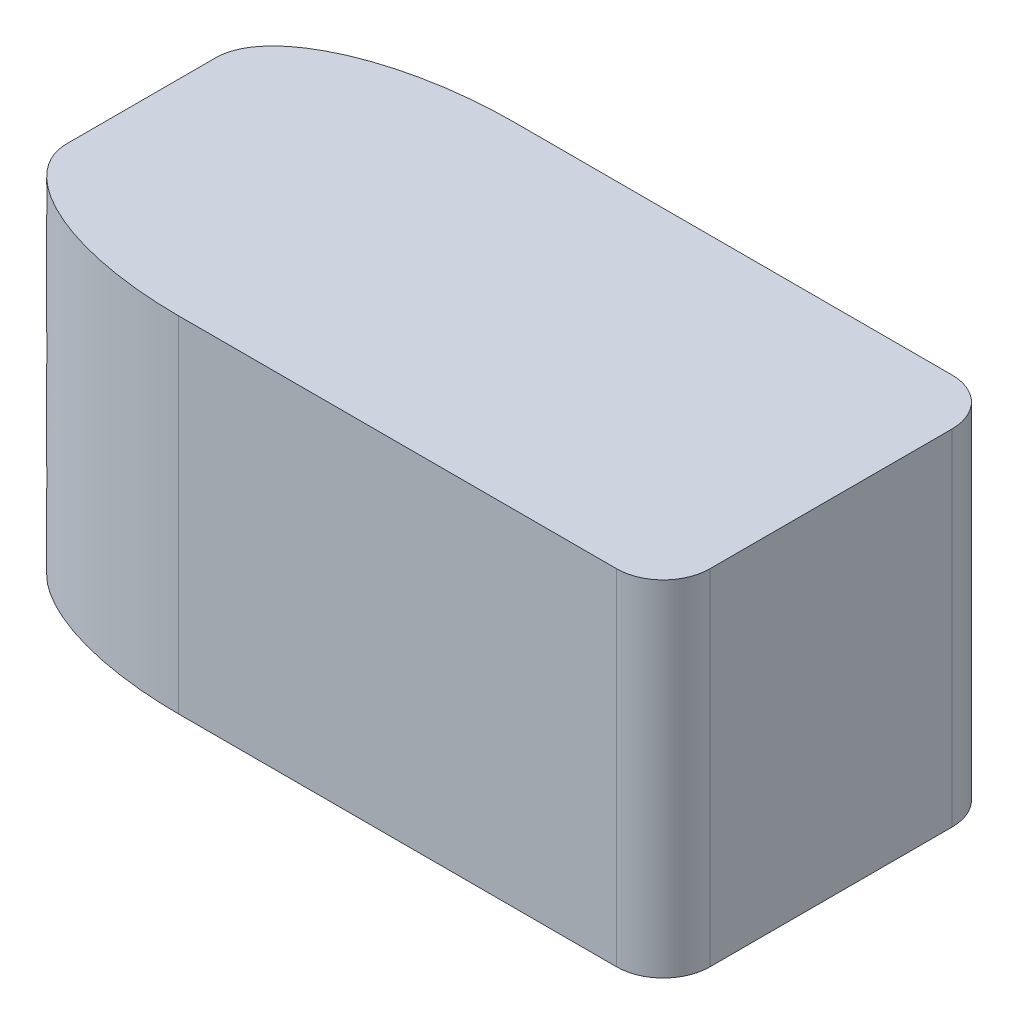
ISO-10303-21;
HEADER;
FILE_DESCRIPTION(('STEP AP214'),'2;1');
FILE_NAME('part.step','',(''),(''),'','','');
FILE_SCHEMA(('AUTOMOTIVE_DESIGN { 1 0 10303 214 1 1 1 1 }'));
ENDSEC;
DATA;
#1=APPLICATION_CONTEXT('core data for automotive mechanical design processes');
#2=APPLICATION_PROTOCOL_DEFINITION('international standard','automotive_design',2000,#1);
#3=PRODUCT_CONTEXT('',#1,'mechanical');
#4=PRODUCT('Part','Part','',(#3));
#5=PRODUCT_RELATED_PRODUCT_CATEGORY('part','',(#4));
#6=PRODUCT_DEFINITION_FORMATION('','',#4);
#7=PRODUCT_DEFINITION_CONTEXT('part definition',#1,'design');
#8=PRODUCT_DEFINITION('design','',#6,#7);
#9=PRODUCT_DEFINITION_SHAPE('','',#8);
#10=(LENGTH_UNIT() NAMED_UNIT(*) SI_UNIT(.MILLI.,.METRE.));
#11=(NAMED_UNIT(*) PLANE_ANGLE_UNIT() SI_UNIT($,.RADIAN.));
#12=(NAMED_UNIT(*) SI_UNIT($,.STERADIAN.) SOLID_ANGLE_UNIT());
#13=UNCERTAINTY_MEASURE_WITH_UNIT(LENGTH_MEASURE(1.E-05),#10,'distance_accuracy_value','');
#14=(GEOMETRIC_REPRESENTATION_CONTEXT(3) GLOBAL_UNCERTAINTY_ASSIGNED_CONTEXT((#13)) GLOBAL_UNIT_ASSIGNED_CONTEXT((#10,
#11,#12)) REPRESENTATION_CONTEXT('',''));
#15=CARTESIAN_POINT('',(0.,0.,0.));
#16=DIRECTION('',(0.,0.,1.));
#17=DIRECTION('',(1.,0.,0.));
#18=AXIS2_PLACEMENT_3D('',#15,#16,#17);
#19=CARTESIAN_POINT('',(-37.,18.5,18.));
#20=DIRECTION('',(1.,0.,0.));
#21=DIRECTION('',(0.,0.,-1.));
#22=AXIS2_PLACEMENT_3D('',#19,#20,#21);
#23=PLANE('',#22);
#24=DIRECTION('',(0.,0.,1.));
#25=VECTOR('',#24,1.);
#26=CARTESIAN_POINT('',(-37.,18.5,18.));
#27=LINE('',#26,#25);
#28=CARTESIAN_POINT('',(-37.,18.5,-8.));
#29=VERTEX_POINT('',#28);
#30=CARTESIAN_POINT('',(-37.,18.5,8.));
#31=VERTEX_POINT('',#30);
#32=EDGE_CURVE('E143',#29,#31,#27,.T.);
#33=ORIENTED_EDGE('',*,*,#32,.F.);
#34=CARTESIAN_POINT('',(-37.,-20.35,-8.));
#35=CARTESIAN_POINT('',(-37.,-6.78333333333331,-8.));
#36=CARTESIAN_POINT('',(-37.,6.78333333333332,-8.));
#37=CARTESIAN_POINT('',(-37.,20.35,-8.));
#38=(BOUNDED_CURVE() B_SPLINE_CURVE(3,(#34,#35,#36,#37),.UNSPECIFIED.,.F.,
.F.) B_SPLINE_CURVE_WITH_KNOTS((4,4),(-0.00185,0.03885),
.UNSPECIFIED.) CURVE() GEOMETRIC_REPRESENTATION_ITEM() RATIONAL_B_SPLINE_CURVE((1.,1.,1.,1.)) REPRESENTATION_ITEM(''));
#39=CARTESIAN_POINT('',(-37.,-18.5,-8.));
#40=VERTEX_POINT('',#39);
#41=EDGE_CURVE('E124',#29,#40,#38,.F.);
#42=ORIENTED_EDGE('',*,*,#41,.T.);
#43=DIRECTION('',(0.,0.,1.));
#44=VECTOR('',#43,1.);
#45=CARTESIAN_POINT('',(-37.,-18.5,18.));
#46=LINE('',#45,#44);
#47=CARTESIAN_POINT('',(-37.,-18.5,8.));
#48=VERTEX_POINT('',#47);
#49=EDGE_CURVE('E140',#40,#48,#46,.T.);
#50=ORIENTED_EDGE('',*,*,#49,.T.);
#51=CARTESIAN_POINT('',(-37.,20.35,8.));
#52=CARTESIAN_POINT('',(-37.,6.78333333333332,8.));
#53=CARTESIAN_POINT('',(-37.,-6.78333333333331,8.));
#54=CARTESIAN_POINT('',(-37.,-20.35,8.));
#55=(BOUNDED_CURVE() B_SPLINE_CURVE(3,(#51,#52,#53,#54),.UNSPECIFIED.,.F.,
.F.) B_SPLINE_CURVE_WITH_KNOTS((4,4),(-0.00185,0.03885),
.UNSPECIFIED.) CURVE() GEOMETRIC_REPRESENTATION_ITEM() RATIONAL_B_SPLINE_CURVE((1.,1.,1.,1.)) REPRESENTATION_ITEM(''));
#56=EDGE_CURVE('E144',#48,#31,#55,.F.);
#57=ORIENTED_EDGE('',*,*,#56,.T.);
#58=EDGE_LOOP('',(#33,#42,#50,#57));
#59=FACE_BOUND('',#58,.T.);
#60=ADVANCED_FACE('F51',(#59),#23,.F.);
#61=CARTESIAN_POINT('',(37.,18.5,18.));
#62=DIRECTION('',(0.,0.,-1.));
#63=DIRECTION('',(-1.,0.,0.));
#64=AXIS2_PLACEMENT_3D('',#61,#62,#63);
#65=PLANE('',#64);
#66=DIRECTION('',(1.,0.,0.));
#67=VECTOR('',#66,1.);
#68=CARTESIAN_POINT('',(37.,-18.5,18.));
#69=LINE('',#68,#67);
#70=CARTESIAN_POINT('',(-15.,-18.5,18.));
#71=VERTEX_POINT('',#70);
#72=CARTESIAN_POINT('',(32.,-18.5,18.));
#73=VERTEX_POINT('',#72);
#74=EDGE_CURVE('E150',#71,#73,#69,.T.);
#75=ORIENTED_EDGE('',*,*,#74,.T.);
#76=DIRECTION('',(0.,-1.,0.));
#77=VECTOR('',#76,1.);
#78=CARTESIAN_POINT('',(32.,18.5,18.));
#79=LINE('',#78,#77);
#80=CARTESIAN_POINT('',(32.,18.5,18.));
#81=VERTEX_POINT('',#80);
#82=EDGE_CURVE('E12',#73,#81,#79,.F.);
#83=ORIENTED_EDGE('',*,*,#82,.T.);
#84=DIRECTION('',(1.,0.,0.));
#85=VECTOR('',#84,1.);
#86=CARTESIAN_POINT('',(37.,18.5,18.));
#87=LINE('',#86,#85);
#88=CARTESIAN_POINT('',(-15.,18.5,18.));
#89=VERTEX_POINT('',#88);
#90=EDGE_CURVE('E204',#89,#81,#87,.T.);
#91=ORIENTED_EDGE('',*,*,#90,.F.);
#92=CARTESIAN_POINT('',(-15.,-20.35,18.));
#93=CARTESIAN_POINT('',(-15.,-6.78333333333331,18.));
#94=CARTESIAN_POINT('',(-15.,6.78333333333332,18.));
#95=CARTESIAN_POINT('',(-15.,20.35,18.));
#96=(BOUNDED_CURVE() B_SPLINE_CURVE(3,(#92,#93,#94,#95),.UNSPECIFIED.,.F.,
.F.) B_SPLINE_CURVE_WITH_KNOTS((4,4),(-0.00185,0.03885),
.UNSPECIFIED.) CURVE() GEOMETRIC_REPRESENTATION_ITEM() RATIONAL_B_SPLINE_CURVE((1.,1.,1.,1.)) REPRESENTATION_ITEM(''));
#97=EDGE_CURVE('E228',#89,#71,#96,.F.);
#98=ORIENTED_EDGE('',*,*,#97,.T.);
#99=EDGE_LOOP('',(#75,#83,#91,#98));
#100=FACE_BOUND('',#99,.T.);
#101=ADVANCED_FACE('F350',(#100),#65,.F.);
#102=CARTESIAN_POINT('',(37.,18.5,18.));
#103=DIRECTION('',(-1.,0.,0.));
#104=DIRECTION('',(0.,0.,1.));
#105=AXIS2_PLACEMENT_3D('',#102,#103,#104);
#106=PLANE('',#105);
#107=DIRECTION('',(0.,0.,-1.));
#108=VECTOR('',#107,1.);
#109=CARTESIAN_POINT('',(37.,-18.5,18.));
#110=LINE('',#109,#108);
#111=CARTESIAN_POINT('',(37.,-18.5,13.));
#112=VERTEX_POINT('',#111);
#113=CARTESIAN_POINT('',(37.,-18.5,-13.));
#114=VERTEX_POINT('',#113);
#115=EDGE_CURVE('E152',#112,#114,#110,.T.);
#116=ORIENTED_EDGE('',*,*,#115,.T.);
#117=DIRECTION('',(0.,-1.,0.));
#118=VECTOR('',#117,1.);
#119=CARTESIAN_POINT('',(37.,18.5,-13.));
#120=LINE('',#119,#118);
#121=CARTESIAN_POINT('',(37.,18.5,-13.));
#122=VERTEX_POINT('',#121);
#123=EDGE_CURVE('E72',#114,#122,#120,.F.);
#124=ORIENTED_EDGE('',*,*,#123,.T.);
#125=DIRECTION('',(0.,0.,-1.));
#126=VECTOR('',#125,1.);
#127=CARTESIAN_POINT('',(37.,18.5,18.));
#128=LINE('',#127,#126);
#129=CARTESIAN_POINT('',(37.,18.5,13.));
#130=VERTEX_POINT('',#129);
#131=EDGE_CURVE('E212',#130,#122,#128,.T.);
#132=ORIENTED_EDGE('',*,*,#131,.F.);
#133=DIRECTION('',(0.,-1.,0.));
#134=VECTOR('',#133,1.);
#135=CARTESIAN_POINT('',(37.,18.5,13.));
#136=LINE('',#135,#134);
#137=EDGE_CURVE('E232',#130,#112,#136,.T.);
#138=ORIENTED_EDGE('',*,*,#137,.T.);
#139=EDGE_LOOP('',(#116,#124,#132,#138));
#140=FACE_BOUND('',#139,.T.);
#141=ADVANCED_FACE('F241',(#140),#106,.F.);
#142=CARTESIAN_POINT('',(37.,18.5,-18.));
#143=DIRECTION('',(0.,0.,1.));
#144=DIRECTION('',(1.,0.,0.));
#145=AXIS2_PLACEMENT_3D('',#142,#143,#144);
#146=PLANE('',#145);
#147=DIRECTION('',(-1.,0.,0.));
#148=VECTOR('',#147,1.);
#149=CARTESIAN_POINT('',(37.,18.5,-18.));
#150=LINE('',#149,#148);
#151=CARTESIAN_POINT('',(32.,18.5,-18.));
#152=VERTEX_POINT('',#151);
#153=CARTESIAN_POINT('',(-15.,18.5,-18.));
#154=VERTEX_POINT('',#153);
#155=EDGE_CURVE('E216',#152,#154,#150,.T.);
#156=ORIENTED_EDGE('',*,*,#155,.F.);
#157=DIRECTION('',(0.,-1.,0.));
#158=VECTOR('',#157,1.);
#159=CARTESIAN_POINT('',(32.,18.5,-18.));
#160=LINE('',#159,#158);
#161=CARTESIAN_POINT('',(32.,-18.5,-18.));
#162=VERTEX_POINT('',#161);
#163=EDGE_CURVE('E224',#152,#162,#160,.T.);
#164=ORIENTED_EDGE('',*,*,#163,.T.);
#165=DIRECTION('',(-1.,0.,0.));
#166=VECTOR('',#165,1.);
#167=CARTESIAN_POINT('',(37.,-18.5,-18.));
#168=LINE('',#167,#166);
#169=CARTESIAN_POINT('',(-15.,-18.5,-18.));
#170=VERTEX_POINT('',#169);
#171=EDGE_CURVE('E222',#162,#170,#168,.T.);
#172=ORIENTED_EDGE('',*,*,#171,.T.);
#173=CARTESIAN_POINT('',(-15.,20.35,-18.));
#174=CARTESIAN_POINT('',(-15.,6.78333333333332,-18.));
#175=CARTESIAN_POINT('',(-15.,-6.78333333333331,-18.));
#176=CARTESIAN_POINT('',(-15.,-20.35,-18.));
#177=(BOUNDED_CURVE() B_SPLINE_CURVE(3,(#173,#174,#175,#176),.UNSPECIFIED.,.F.,
.F.) B_SPLINE_CURVE_WITH_KNOTS((4,4),(-0.00185,0.03885),
.UNSPECIFIED.) CURVE() GEOMETRIC_REPRESENTATION_ITEM() RATIONAL_B_SPLINE_CURVE((1.,1.,1.,1.)) REPRESENTATION_ITEM(''));
#178=EDGE_CURVE('E127',#170,#154,#177,.F.);
#179=ORIENTED_EDGE('',*,*,#178,.T.);
#180=EDGE_LOOP('',(#156,#164,#172,#179));
#181=FACE_BOUND('',#180,.T.);
#182=ADVANCED_FACE('F186',(#181),#146,.F.);
#183=CARTESIAN_POINT('',(0.,18.5,0.));
#184=DIRECTION('',(0.,1.,0.));
#185=DIRECTION('',(0.,0.,1.));
#186=AXIS2_PLACEMENT_3D('',#183,#184,#185);
#187=PLANE('',#186);
#188=ORIENTED_EDGE('',*,*,#131,.T.);
#189=CARTESIAN_POINT('',(32.,18.5,-13.));
#190=DIRECTION('',(0.,1.,0.));
#191=DIRECTION('',(0.,0.,1.));
#192=AXIS2_PLACEMENT_3D('',#189,#190,#191);
#193=CIRCLE('',#192,5.);
#194=EDGE_CURVE('E59',#122,#152,#193,.T.);
#195=ORIENTED_EDGE('',*,*,#194,.T.);
#196=ORIENTED_EDGE('',*,*,#155,.T.);
#197=CARTESIAN_POINT('',(-37.,18.5,-8.));
#198=CARTESIAN_POINT('',(-37.,18.5,-18.));
#199=CARTESIAN_POINT('',(-15.,18.5,-18.));
#200=(BOUNDED_CURVE() B_SPLINE_CURVE(2,(#197,#198,#199),.UNSPECIFIED.,.F.,
.F.) B_SPLINE_CURVE_WITH_KNOTS((3,3),(0.,1.),
.UNSPECIFIED.) CURVE() GEOMETRIC_REPRESENTATION_ITEM() RATIONAL_B_SPLINE_CURVE((1.,
0.707106781186548,1.)) REPRESENTATION_ITEM(''));
#201=EDGE_CURVE('E245',#154,#29,#200,.F.);
#202=ORIENTED_EDGE('',*,*,#201,.T.);
#203=ORIENTED_EDGE('',*,*,#32,.T.);
#204=CARTESIAN_POINT('',(-15.,18.5,18.));
#205=CARTESIAN_POINT('',(-37.,18.5,18.));
#206=CARTESIAN_POINT('',(-37.,18.5,8.));
#207=(BOUNDED_CURVE() B_SPLINE_CURVE(2,(#204,#205,#206),.UNSPECIFIED.,.F.,
.F.) B_SPLINE_CURVE_WITH_KNOTS((3,3),(0.,1.),
.UNSPECIFIED.) CURVE() GEOMETRIC_REPRESENTATION_ITEM() RATIONAL_B_SPLINE_CURVE((1.,
0.707106781186547,1.)) REPRESENTATION_ITEM(''));
#208=EDGE_CURVE('E244',#31,#89,#207,.F.);
#209=ORIENTED_EDGE('',*,*,#208,.T.);
#210=ORIENTED_EDGE('',*,*,#90,.T.);
#211=CARTESIAN_POINT('',(32.,18.5,13.));
#212=DIRECTION('',(0.,1.,0.));
#213=DIRECTION('',(0.,0.,1.));
#214=AXIS2_PLACEMENT_3D('',#211,#212,#213);
#215=CIRCLE('',#214,5.);
#216=EDGE_CURVE('E236',#81,#130,#215,.T.);
#217=ORIENTED_EDGE('',*,*,#216,.T.);
#218=EDGE_LOOP('',(#188,#195,#196,#202,#203,#209,#210,#217));
#219=FACE_BOUND('',#218,.T.);
#220=ADVANCED_FACE('F184',(#219),#187,.T.);
#221=CARTESIAN_POINT('',(0.,-18.5,0.));
#222=DIRECTION('',(0.,1.,0.));
#223=DIRECTION('',(0.,0.,1.));
#224=AXIS2_PLACEMENT_3D('',#221,#222,#223);
#225=PLANE('',#224);
#226=ORIENTED_EDGE('',*,*,#171,.F.);
#227=CARTESIAN_POINT('',(32.,-18.5,-13.));
#228=DIRECTION('',(0.,1.,0.));
#229=DIRECTION('',(0.,0.,1.));
#230=AXIS2_PLACEMENT_3D('',#227,#228,#229);
#231=CIRCLE('',#230,5.);
#232=EDGE_CURVE('E230',#162,#114,#231,.F.);
#233=ORIENTED_EDGE('',*,*,#232,.T.);
#234=ORIENTED_EDGE('',*,*,#115,.F.);
#235=CARTESIAN_POINT('',(32.,-18.5,13.));
#236=DIRECTION('',(0.,1.,0.));
#237=DIRECTION('',(0.,0.,1.));
#238=AXIS2_PLACEMENT_3D('',#235,#236,#237);
#239=CIRCLE('',#238,5.);
#240=EDGE_CURVE('E227',#112,#73,#239,.F.);
#241=ORIENTED_EDGE('',*,*,#240,.T.);
#242=ORIENTED_EDGE('',*,*,#74,.F.);
#243=CARTESIAN_POINT('',(-37.,-18.5,8.));
#244=CARTESIAN_POINT('',(-37.,-18.5,18.));
#245=CARTESIAN_POINT('',(-15.,-18.5,18.));
#246=(BOUNDED_CURVE() B_SPLINE_CURVE(2,(#243,#244,#245),.UNSPECIFIED.,.F.,
.F.) B_SPLINE_CURVE_WITH_KNOTS((3,3),(0.,1.),
.UNSPECIFIED.) CURVE() GEOMETRIC_REPRESENTATION_ITEM() RATIONAL_B_SPLINE_CURVE((1.,
0.707106781186547,1.)) REPRESENTATION_ITEM(''));
#247=EDGE_CURVE('E133',#71,#48,#246,.F.);
#248=ORIENTED_EDGE('',*,*,#247,.T.);
#249=ORIENTED_EDGE('',*,*,#49,.F.);
#250=CARTESIAN_POINT('',(-15.,-18.5,-18.));
#251=CARTESIAN_POINT('',(-37.,-18.5,-18.));
#252=CARTESIAN_POINT('',(-37.,-18.5,-8.));
#253=(BOUNDED_CURVE() B_SPLINE_CURVE(2,(#250,#251,#252),.UNSPECIFIED.,.F.,
.F.) B_SPLINE_CURVE_WITH_KNOTS((3,3),(0.,1.),
.UNSPECIFIED.) CURVE() GEOMETRIC_REPRESENTATION_ITEM() RATIONAL_B_SPLINE_CURVE((1.,
0.707106781186548,1.)) REPRESENTATION_ITEM(''));
#254=EDGE_CURVE('E119',#40,#170,#253,.F.);
#255=ORIENTED_EDGE('',*,*,#254,.T.);
#256=EDGE_LOOP('',(#226,#233,#234,#241,#242,#248,#249,#255));
#257=FACE_BOUND('',#256,.T.);
#258=ADVANCED_FACE('F147',(#257),#225,.F.);
#259=CARTESIAN_POINT('',(-37.,20.35,-8.));
#260=CARTESIAN_POINT('',(-37.,6.78333333333332,-8.));
#261=CARTESIAN_POINT('',(-37.,-6.78333333333331,-8.));
#262=CARTESIAN_POINT('',(-37.,-20.35,-8.));
#263=CARTESIAN_POINT('',(-37.,20.35,-18.));
#264=CARTESIAN_POINT('',(-37.,6.78333333333332,-18.));
#265=CARTESIAN_POINT('',(-37.,-6.78333333333331,-18.));
#266=CARTESIAN_POINT('',(-37.,-20.35,-18.));
#267=CARTESIAN_POINT('',(-15.,20.35,-18.));
#268=CARTESIAN_POINT('',(-15.,6.78333333333332,-18.));
#269=CARTESIAN_POINT('',(-15.,-6.78333333333331,-18.));
#270=CARTESIAN_POINT('',(-15.,-20.35,-18.));
#271=(BOUNDED_SURFACE() B_SPLINE_SURFACE(2,3,((#259,#260,#261,#262),(#263,#264,#265,#266),(#267,
#268,#269,#270)),.UNSPECIFIED.,.F.,.F.,.F.) B_SPLINE_SURFACE_WITH_KNOTS((3,3),(4,4),(0.,1.),
(-0.00185,0.03885),
.UNSPECIFIED.) GEOMETRIC_REPRESENTATION_ITEM() RATIONAL_B_SPLINE_SURFACE(((1.,1.,1.,1.),
(0.707106781186548,0.707106781186548,0.707106781186548,0.707106781186548),(1.,1.,1.,1.))) REPRESENTATION_ITEM('') SURFACE());
#272=ORIENTED_EDGE('',*,*,#201,.F.);
#273=ORIENTED_EDGE('',*,*,#178,.F.);
#274=ORIENTED_EDGE('',*,*,#254,.F.);
#275=ORIENTED_EDGE('',*,*,#41,.F.);
#276=EDGE_LOOP('',(#272,#273,#274,#275));
#277=FACE_BOUND('',#276,.T.);
#278=ADVANCED_FACE('F123',(#277),#271,.T.);
#279=CARTESIAN_POINT('',(-15.,20.35,18.));
#280=CARTESIAN_POINT('',(-15.,6.78333333333332,18.));
#281=CARTESIAN_POINT('',(-15.,-6.78333333333331,18.));
#282=CARTESIAN_POINT('',(-15.,-20.35,18.));
#283=CARTESIAN_POINT('',(-37.,20.35,18.));
#284=CARTESIAN_POINT('',(-37.,6.78333333333332,18.));
#285=CARTESIAN_POINT('',(-37.,-6.78333333333331,18.));
#286=CARTESIAN_POINT('',(-37.,-20.35,18.));
#287=CARTESIAN_POINT('',(-37.,20.35,8.));
#288=CARTESIAN_POINT('',(-37.,6.78333333333332,8.));
#289=CARTESIAN_POINT('',(-37.,-6.78333333333331,8.));
#290=CARTESIAN_POINT('',(-37.,-20.35,8.));
#291=(BOUNDED_SURFACE() B_SPLINE_SURFACE(2,3,((#279,#280,#281,#282),(#283,#284,#285,#286),(#287,
#288,#289,#290)),.UNSPECIFIED.,.F.,.F.,.F.) B_SPLINE_SURFACE_WITH_KNOTS((3,3),(4,4),(0.,1.),
(-0.00185,0.03885),
.UNSPECIFIED.) GEOMETRIC_REPRESENTATION_ITEM() RATIONAL_B_SPLINE_SURFACE(((1.,1.,1.,1.),
(0.707106781186547,0.707106781186547,0.707106781186547,0.707106781186547),(1.,1.,1.,1.))) REPRESENTATION_ITEM('') SURFACE());
#292=ORIENTED_EDGE('',*,*,#208,.F.);
#293=ORIENTED_EDGE('',*,*,#56,.F.);
#294=ORIENTED_EDGE('',*,*,#247,.F.);
#295=ORIENTED_EDGE('',*,*,#97,.F.);
#296=EDGE_LOOP('',(#292,#293,#294,#295));
#297=FACE_BOUND('',#296,.T.);
#298=ADVANCED_FACE('F250',(#297),#291,.T.);
#299=CARTESIAN_POINT('',(32.,18.5,-13.));
#300=DIRECTION('',(0.,-1.,0.));
#301=DIRECTION('',(0.,0.,-1.));
#302=AXIS2_PLACEMENT_3D('',#299,#300,#301);
#303=CYLINDRICAL_SURFACE('',#302,5.);
#304=ORIENTED_EDGE('',*,*,#194,.F.);
#305=ORIENTED_EDGE('',*,*,#123,.F.);
#306=ORIENTED_EDGE('',*,*,#232,.F.);
#307=ORIENTED_EDGE('',*,*,#163,.F.);
#308=EDGE_LOOP('',(#304,#305,#306,#307));
#309=FACE_BOUND('',#308,.T.);
#310=ADVANCED_FACE('F239',(#309),#303,.T.);
#311=CARTESIAN_POINT('',(32.,18.5,13.));
#312=DIRECTION('',(0.,-1.,0.));
#313=DIRECTION('',(0.,0.,-1.));
#314=AXIS2_PLACEMENT_3D('',#311,#312,#313);
#315=CYLINDRICAL_SURFACE('',#314,5.);
#316=ORIENTED_EDGE('',*,*,#216,.F.);
#317=ORIENTED_EDGE('',*,*,#82,.F.);
#318=ORIENTED_EDGE('',*,*,#240,.F.);
#319=ORIENTED_EDGE('',*,*,#137,.F.);
#320=EDGE_LOOP('',(#316,#317,#318,#319));
#321=FACE_BOUND('',#320,.T.);
#322=ADVANCED_FACE('F53',(#321),#315,.T.);
#323=CLOSED_SHELL('',(#60,#101,#141,#182,#220,#258,#278,#298,#310,#322));
#324=MANIFOLD_SOLID_BREP('B2',#323);
#325=ADVANCED_BREP_SHAPE_REPRESENTATION('',(#18,#324),#14);
#326=SHAPE_DEFINITION_REPRESENTATION(#9,#325);
ENDSEC;
END-ISO-10303-21;
